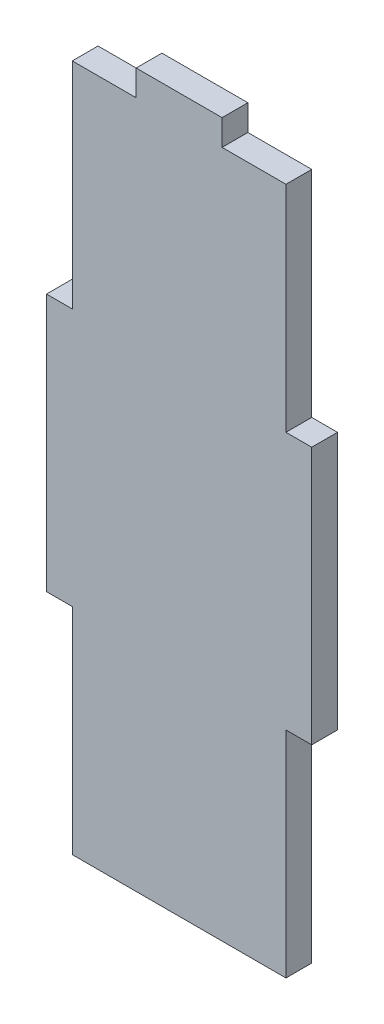
ISO-10303-21;
HEADER;
FILE_DESCRIPTION(('STEP AP214'),'2;1');
FILE_NAME('part.step','',(''),(''),'','','');
FILE_SCHEMA(('AUTOMOTIVE_DESIGN { 1 0 10303 214 1 1 1 1 }'));
ENDSEC;
DATA;
#1=APPLICATION_CONTEXT('core data for automotive mechanical design processes');
#2=APPLICATION_PROTOCOL_DEFINITION('international standard','automotive_design',2000,#1);
#3=PRODUCT_CONTEXT('',#1,'mechanical');
#4=PRODUCT('Part','Part','',(#3));
#5=PRODUCT_RELATED_PRODUCT_CATEGORY('part','',(#4));
#6=PRODUCT_DEFINITION_FORMATION('','',#4);
#7=PRODUCT_DEFINITION_CONTEXT('part definition',#1,'design');
#8=PRODUCT_DEFINITION('design','',#6,#7);
#9=PRODUCT_DEFINITION_SHAPE('','',#8);
#10=(LENGTH_UNIT() NAMED_UNIT(*) SI_UNIT(.MILLI.,.METRE.));
#11=(NAMED_UNIT(*) PLANE_ANGLE_UNIT() SI_UNIT($,.RADIAN.));
#12=(NAMED_UNIT(*) SI_UNIT($,.STERADIAN.) SOLID_ANGLE_UNIT());
#13=UNCERTAINTY_MEASURE_WITH_UNIT(LENGTH_MEASURE(1.E-05),#10,'distance_accuracy_value','');
#14=(GEOMETRIC_REPRESENTATION_CONTEXT(3) GLOBAL_UNCERTAINTY_ASSIGNED_CONTEXT((#13)) GLOBAL_UNIT_ASSIGNED_CONTEXT((#10,
#11,#12)) REPRESENTATION_CONTEXT('',''));
#15=CARTESIAN_POINT('',(0.,0.,0.));
#16=DIRECTION('',(0.,0.,1.));
#17=DIRECTION('',(1.,0.,0.));
#18=AXIS2_PLACEMENT_3D('',#15,#16,#17);
#19=CARTESIAN_POINT('',(24.87,0.,3.));
#20=DIRECTION('',(1.,0.,0.));
#21=DIRECTION('',(0.,1.,0.));
#22=AXIS2_PLACEMENT_3D('',#19,#20,#21);
#23=PLANE('',#22);
#24=DIRECTION('',(0.,-1.,0.));
#25=VECTOR('',#24,1.);
#26=CARTESIAN_POINT('',(24.87,0.,0.));
#27=LINE('',#26,#25);
#28=CARTESIAN_POINT('',(24.87,-55.,0.));
#29=VERTEX_POINT('',#28);
#30=CARTESIAN_POINT('',(24.87,-80.,0.));
#31=VERTEX_POINT('',#30);
#32=EDGE_CURVE('E195',#29,#31,#27,.T.);
#33=ORIENTED_EDGE('',*,*,#32,.F.);
#34=DIRECTION('',(0.,0.,-1.));
#35=VECTOR('',#34,1.);
#36=CARTESIAN_POINT('',(24.87,-55.,3.));
#37=LINE('',#36,#35);
#38=CARTESIAN_POINT('',(24.87,-55.,3.));
#39=VERTEX_POINT('',#38);
#40=EDGE_CURVE('E11',#39,#29,#37,.T.);
#41=ORIENTED_EDGE('',*,*,#40,.F.);
#42=DIRECTION('',(0.,-1.,0.));
#43=VECTOR('',#42,1.);
#44=CARTESIAN_POINT('',(24.87,0.,3.));
#45=LINE('',#44,#43);
#46=CARTESIAN_POINT('',(24.87,-80.,3.));
#47=VERTEX_POINT('',#46);
#48=EDGE_CURVE('E252',#39,#47,#45,.T.);
#49=ORIENTED_EDGE('',*,*,#48,.T.);
#50=DIRECTION('',(0.,0.,-1.));
#51=VECTOR('',#50,1.);
#52=CARTESIAN_POINT('',(24.87,-80.,3.));
#53=LINE('',#52,#51);
#54=EDGE_CURVE('E122',#47,#31,#53,.T.);
#55=ORIENTED_EDGE('',*,*,#54,.T.);
#56=EDGE_LOOP('',(#33,#41,#49,#55));
#57=FACE_BOUND('',#56,.T.);
#58=ADVANCED_FACE('F47',(#57),#23,.T.);
#59=CARTESIAN_POINT('',(0.,-55.,3.));
#60=DIRECTION('',(0.,1.,0.));
#61=DIRECTION('',(0.,0.,1.));
#62=AXIS2_PLACEMENT_3D('',#59,#60,#61);
#63=PLANE('',#62);
#64=DIRECTION('',(1.,0.,0.));
#65=VECTOR('',#64,1.);
#66=CARTESIAN_POINT('',(0.,-55.,0.));
#67=LINE('',#66,#65);
#68=CARTESIAN_POINT('',(27.87,-55.,0.));
#69=VERTEX_POINT('',#68);
#70=EDGE_CURVE('E199',#29,#69,#67,.T.);
#71=ORIENTED_EDGE('',*,*,#70,.T.);
#72=DIRECTION('',(0.,0.,-1.));
#73=VECTOR('',#72,1.);
#74=CARTESIAN_POINT('',(27.87,-55.,3.));
#75=LINE('',#74,#73);
#76=CARTESIAN_POINT('',(27.87,-55.,3.));
#77=VERTEX_POINT('',#76);
#78=EDGE_CURVE('E56',#77,#69,#75,.T.);
#79=ORIENTED_EDGE('',*,*,#78,.F.);
#80=DIRECTION('',(1.,0.,0.));
#81=VECTOR('',#80,1.);
#82=CARTESIAN_POINT('',(0.,-55.,3.));
#83=LINE('',#82,#81);
#84=EDGE_CURVE('E312',#39,#77,#83,.T.);
#85=ORIENTED_EDGE('',*,*,#84,.F.);
#86=ORIENTED_EDGE('',*,*,#40,.T.);
#87=EDGE_LOOP('',(#71,#79,#85,#86));
#88=FACE_BOUND('',#87,.T.);
#89=ADVANCED_FACE('F300',(#88),#63,.F.);
#90=CARTESIAN_POINT('',(27.87,0.,3.));
#91=DIRECTION('',(1.,0.,0.));
#92=DIRECTION('',(0.,1.,0.));
#93=AXIS2_PLACEMENT_3D('',#90,#91,#92);
#94=PLANE('',#93);
#95=DIRECTION('',(0.,-1.,0.));
#96=VECTOR('',#95,1.);
#97=CARTESIAN_POINT('',(27.87,0.,0.));
#98=LINE('',#97,#96);
#99=CARTESIAN_POINT('',(27.87,-25.,0.));
#100=VERTEX_POINT('',#99);
#101=EDGE_CURVE('E203',#100,#69,#98,.T.);
#102=ORIENTED_EDGE('',*,*,#101,.F.);
#103=DIRECTION('',(0.,0.,-1.));
#104=VECTOR('',#103,1.);
#105=CARTESIAN_POINT('',(27.87,-25.,3.));
#106=LINE('',#105,#104);
#107=CARTESIAN_POINT('',(27.87,-25.,3.));
#108=VERTEX_POINT('',#107);
#109=EDGE_CURVE('E288',#108,#100,#106,.T.);
#110=ORIENTED_EDGE('',*,*,#109,.F.);
#111=DIRECTION('',(0.,-1.,0.));
#112=VECTOR('',#111,1.);
#113=CARTESIAN_POINT('',(27.87,0.,3.));
#114=LINE('',#113,#112);
#115=EDGE_CURVE('E297',#108,#77,#114,.T.);
#116=ORIENTED_EDGE('',*,*,#115,.T.);
#117=ORIENTED_EDGE('',*,*,#78,.T.);
#118=EDGE_LOOP('',(#102,#110,#116,#117));
#119=FACE_BOUND('',#118,.T.);
#120=ADVANCED_FACE('F295',(#119),#94,.T.);
#121=CARTESIAN_POINT('',(0.,-25.,3.));
#122=DIRECTION('',(0.,1.,0.));
#123=DIRECTION('',(0.,0.,1.));
#124=AXIS2_PLACEMENT_3D('',#121,#122,#123);
#125=PLANE('',#124);
#126=DIRECTION('',(1.,0.,0.));
#127=VECTOR('',#126,1.);
#128=CARTESIAN_POINT('',(0.,-25.,0.));
#129=LINE('',#128,#127);
#130=CARTESIAN_POINT('',(24.87,-25.,0.));
#131=VERTEX_POINT('',#130);
#132=EDGE_CURVE('E207',#131,#100,#129,.T.);
#133=ORIENTED_EDGE('',*,*,#132,.F.);
#134=DIRECTION('',(0.,0.,-1.));
#135=VECTOR('',#134,1.);
#136=CARTESIAN_POINT('',(24.87,-25.,3.));
#137=LINE('',#136,#135);
#138=CARTESIAN_POINT('',(24.87,-25.,3.));
#139=VERTEX_POINT('',#138);
#140=EDGE_CURVE('E285',#139,#131,#137,.T.);
#141=ORIENTED_EDGE('',*,*,#140,.F.);
#142=DIRECTION('',(1.,0.,0.));
#143=VECTOR('',#142,1.);
#144=CARTESIAN_POINT('',(0.,-25.,3.));
#145=LINE('',#144,#143);
#146=EDGE_CURVE('E309',#139,#108,#145,.T.);
#147=ORIENTED_EDGE('',*,*,#146,.T.);
#148=ORIENTED_EDGE('',*,*,#109,.T.);
#149=EDGE_LOOP('',(#133,#141,#147,#148));
#150=FACE_BOUND('',#149,.T.);
#151=ADVANCED_FACE('F306',(#150),#125,.T.);
#152=CARTESIAN_POINT('',(24.87,0.,3.));
#153=DIRECTION('',(1.,0.,0.));
#154=DIRECTION('',(0.,1.,0.));
#155=AXIS2_PLACEMENT_3D('',#152,#153,#154);
#156=PLANE('',#155);
#157=DIRECTION('',(0.,-1.,0.));
#158=VECTOR('',#157,1.);
#159=CARTESIAN_POINT('',(24.87,0.,0.));
#160=LINE('',#159,#158);
#161=CARTESIAN_POINT('',(24.87,0.,0.));
#162=VERTEX_POINT('',#161);
#163=EDGE_CURVE('E211',#162,#131,#160,.T.);
#164=ORIENTED_EDGE('',*,*,#163,.F.);
#165=DIRECTION('',(0.,0.,-1.));
#166=VECTOR('',#165,1.);
#167=CARTESIAN_POINT('',(24.87,0.,3.));
#168=LINE('',#167,#166);
#169=CARTESIAN_POINT('',(24.87,0.,3.));
#170=VERTEX_POINT('',#169);
#171=EDGE_CURVE('E282',#170,#162,#168,.T.);
#172=ORIENTED_EDGE('',*,*,#171,.F.);
#173=DIRECTION('',(0.,-1.,0.));
#174=VECTOR('',#173,1.);
#175=CARTESIAN_POINT('',(24.87,0.,3.));
#176=LINE('',#175,#174);
#177=EDGE_CURVE('E317',#170,#139,#176,.T.);
#178=ORIENTED_EDGE('',*,*,#177,.T.);
#179=ORIENTED_EDGE('',*,*,#140,.T.);
#180=EDGE_LOOP('',(#164,#172,#178,#179));
#181=FACE_BOUND('',#180,.T.);
#182=ADVANCED_FACE('F372',(#181),#156,.T.);
#183=CARTESIAN_POINT('',(0.,0.,3.));
#184=DIRECTION('',(0.,1.,0.));
#185=DIRECTION('',(0.,0.,1.));
#186=AXIS2_PLACEMENT_3D('',#183,#184,#185);
#187=PLANE('',#186);
#188=DIRECTION('',(1.,0.,0.));
#189=VECTOR('',#188,1.);
#190=CARTESIAN_POINT('',(0.,0.,0.));
#191=LINE('',#190,#189);
#192=CARTESIAN_POINT('',(17.435,0.,0.));
#193=VERTEX_POINT('',#192);
#194=EDGE_CURVE('E215',#193,#162,#191,.T.);
#195=ORIENTED_EDGE('',*,*,#194,.F.);
#196=DIRECTION('',(0.,0.,-1.));
#197=VECTOR('',#196,1.);
#198=CARTESIAN_POINT('',(17.435,0.,3.));
#199=LINE('',#198,#197);
#200=CARTESIAN_POINT('',(17.435,0.,3.));
#201=VERTEX_POINT('',#200);
#202=EDGE_CURVE('E279',#201,#193,#199,.T.);
#203=ORIENTED_EDGE('',*,*,#202,.F.);
#204=DIRECTION('',(1.,0.,0.));
#205=VECTOR('',#204,1.);
#206=CARTESIAN_POINT('',(0.,0.,3.));
#207=LINE('',#206,#205);
#208=EDGE_CURVE('E324',#201,#170,#207,.T.);
#209=ORIENTED_EDGE('',*,*,#208,.T.);
#210=ORIENTED_EDGE('',*,*,#171,.T.);
#211=EDGE_LOOP('',(#195,#203,#209,#210));
#212=FACE_BOUND('',#211,.T.);
#213=ADVANCED_FACE('F375',(#212),#187,.T.);
#214=CARTESIAN_POINT('',(17.435,0.,3.));
#215=DIRECTION('',(-1.,0.,0.));
#216=DIRECTION('',(0.,0.,1.));
#217=AXIS2_PLACEMENT_3D('',#214,#215,#216);
#218=PLANE('',#217);
#219=DIRECTION('',(0.,1.,0.));
#220=VECTOR('',#219,1.);
#221=CARTESIAN_POINT('',(17.435,0.,0.));
#222=LINE('',#221,#220);
#223=CARTESIAN_POINT('',(17.435,3.,0.));
#224=VERTEX_POINT('',#223);
#225=EDGE_CURVE('E219',#193,#224,#222,.T.);
#226=ORIENTED_EDGE('',*,*,#225,.T.);
#227=DIRECTION('',(0.,0.,-1.));
#228=VECTOR('',#227,1.);
#229=CARTESIAN_POINT('',(17.435,3.,3.));
#230=LINE('',#229,#228);
#231=CARTESIAN_POINT('',(17.435,3.,3.));
#232=VERTEX_POINT('',#231);
#233=EDGE_CURVE('E276',#232,#224,#230,.T.);
#234=ORIENTED_EDGE('',*,*,#233,.F.);
#235=DIRECTION('',(0.,1.,0.));
#236=VECTOR('',#235,1.);
#237=CARTESIAN_POINT('',(17.435,0.,3.));
#238=LINE('',#237,#236);
#239=EDGE_CURVE('E328',#201,#232,#238,.T.);
#240=ORIENTED_EDGE('',*,*,#239,.F.);
#241=ORIENTED_EDGE('',*,*,#202,.T.);
#242=EDGE_LOOP('',(#226,#234,#240,#241));
#243=FACE_BOUND('',#242,.T.);
#244=ADVANCED_FACE('F379',(#243),#218,.F.);
#245=CARTESIAN_POINT('',(0.,3.,3.));
#246=DIRECTION('',(0.,1.,0.));
#247=DIRECTION('',(0.,0.,1.));
#248=AXIS2_PLACEMENT_3D('',#245,#246,#247);
#249=PLANE('',#248);
#250=DIRECTION('',(1.,0.,0.));
#251=VECTOR('',#250,1.);
#252=CARTESIAN_POINT('',(0.,3.,0.));
#253=LINE('',#252,#251);
#254=CARTESIAN_POINT('',(7.435,3.,0.));
#255=VERTEX_POINT('',#254);
#256=EDGE_CURVE('E223',#255,#224,#253,.T.);
#257=ORIENTED_EDGE('',*,*,#256,.F.);
#258=DIRECTION('',(0.,0.,-1.));
#259=VECTOR('',#258,1.);
#260=CARTESIAN_POINT('',(7.435,3.,3.));
#261=LINE('',#260,#259);
#262=CARTESIAN_POINT('',(7.435,3.,3.));
#263=VERTEX_POINT('',#262);
#264=EDGE_CURVE('E273',#263,#255,#261,.T.);
#265=ORIENTED_EDGE('',*,*,#264,.F.);
#266=DIRECTION('',(1.,0.,0.));
#267=VECTOR('',#266,1.);
#268=CARTESIAN_POINT('',(0.,3.,3.));
#269=LINE('',#268,#267);
#270=EDGE_CURVE('E331',#263,#232,#269,.T.);
#271=ORIENTED_EDGE('',*,*,#270,.T.);
#272=ORIENTED_EDGE('',*,*,#233,.T.);
#273=EDGE_LOOP('',(#257,#265,#271,#272));
#274=FACE_BOUND('',#273,.T.);
#275=ADVANCED_FACE('F383',(#274),#249,.T.);
#276=CARTESIAN_POINT('',(7.435,0.,3.));
#277=DIRECTION('',(-1.,0.,0.));
#278=DIRECTION('',(0.,0.,1.));
#279=AXIS2_PLACEMENT_3D('',#276,#277,#278);
#280=PLANE('',#279);
#281=DIRECTION('',(0.,1.,0.));
#282=VECTOR('',#281,1.);
#283=CARTESIAN_POINT('',(7.435,0.,0.));
#284=LINE('',#283,#282);
#285=CARTESIAN_POINT('',(7.435,0.,0.));
#286=VERTEX_POINT('',#285);
#287=EDGE_CURVE('E227',#286,#255,#284,.T.);
#288=ORIENTED_EDGE('',*,*,#287,.F.);
#289=DIRECTION('',(0.,0.,-1.));
#290=VECTOR('',#289,1.);
#291=CARTESIAN_POINT('',(7.435,0.,3.));
#292=LINE('',#291,#290);
#293=CARTESIAN_POINT('',(7.435,0.,3.));
#294=VERTEX_POINT('',#293);
#295=EDGE_CURVE('E270',#294,#286,#292,.T.);
#296=ORIENTED_EDGE('',*,*,#295,.F.);
#297=DIRECTION('',(0.,1.,0.));
#298=VECTOR('',#297,1.);
#299=CARTESIAN_POINT('',(7.435,0.,3.));
#300=LINE('',#299,#298);
#301=EDGE_CURVE('E335',#294,#263,#300,.T.);
#302=ORIENTED_EDGE('',*,*,#301,.T.);
#303=ORIENTED_EDGE('',*,*,#264,.T.);
#304=EDGE_LOOP('',(#288,#296,#302,#303));
#305=FACE_BOUND('',#304,.T.);
#306=ADVANCED_FACE('F387',(#305),#280,.T.);
#307=CARTESIAN_POINT('',(0.,0.,3.));
#308=DIRECTION('',(0.,1.,0.));
#309=DIRECTION('',(0.,0.,1.));
#310=AXIS2_PLACEMENT_3D('',#307,#308,#309);
#311=PLANE('',#310);
#312=DIRECTION('',(1.,0.,0.));
#313=VECTOR('',#312,1.);
#314=CARTESIAN_POINT('',(0.,0.,0.));
#315=LINE('',#314,#313);
#316=CARTESIAN_POINT('',(0.,0.,0.));
#317=VERTEX_POINT('',#316);
#318=EDGE_CURVE('E231',#317,#286,#315,.T.);
#319=ORIENTED_EDGE('',*,*,#318,.F.);
#320=DIRECTION('',(0.,0.,-1.));
#321=VECTOR('',#320,1.);
#322=CARTESIAN_POINT('',(0.,0.,3.));
#323=LINE('',#322,#321);
#324=CARTESIAN_POINT('',(0.,0.,3.));
#325=VERTEX_POINT('',#324);
#326=EDGE_CURVE('E267',#325,#317,#323,.T.);
#327=ORIENTED_EDGE('',*,*,#326,.F.);
#328=DIRECTION('',(1.,0.,0.));
#329=VECTOR('',#328,1.);
#330=CARTESIAN_POINT('',(0.,0.,3.));
#331=LINE('',#330,#329);
#332=EDGE_CURVE('E339',#325,#294,#331,.T.);
#333=ORIENTED_EDGE('',*,*,#332,.T.);
#334=ORIENTED_EDGE('',*,*,#295,.T.);
#335=EDGE_LOOP('',(#319,#327,#333,#334));
#336=FACE_BOUND('',#335,.T.);
#337=ADVANCED_FACE('F391',(#336),#311,.T.);
#338=CARTESIAN_POINT('',(0.,0.,3.));
#339=DIRECTION('',(1.,0.,0.));
#340=DIRECTION('',(0.,1.,0.));
#341=AXIS2_PLACEMENT_3D('',#338,#339,#340);
#342=PLANE('',#341);
#343=DIRECTION('',(0.,-1.,0.));
#344=VECTOR('',#343,1.);
#345=CARTESIAN_POINT('',(0.,0.,0.));
#346=LINE('',#345,#344);
#347=CARTESIAN_POINT('',(0.,-25.,0.));
#348=VERTEX_POINT('',#347);
#349=EDGE_CURVE('E235',#317,#348,#346,.T.);
#350=ORIENTED_EDGE('',*,*,#349,.T.);
#351=DIRECTION('',(0.,0.,-1.));
#352=VECTOR('',#351,1.);
#353=CARTESIAN_POINT('',(0.,-25.,3.));
#354=LINE('',#353,#352);
#355=CARTESIAN_POINT('',(0.,-25.,3.));
#356=VERTEX_POINT('',#355);
#357=EDGE_CURVE('E263',#356,#348,#354,.T.);
#358=ORIENTED_EDGE('',*,*,#357,.F.);
#359=DIRECTION('',(0.,-1.,0.));
#360=VECTOR('',#359,1.);
#361=CARTESIAN_POINT('',(0.,0.,3.));
#362=LINE('',#361,#360);
#363=EDGE_CURVE('E343',#325,#356,#362,.T.);
#364=ORIENTED_EDGE('',*,*,#363,.F.);
#365=ORIENTED_EDGE('',*,*,#326,.T.);
#366=EDGE_LOOP('',(#350,#358,#364,#365));
#367=FACE_BOUND('',#366,.T.);
#368=ADVANCED_FACE('F395',(#367),#342,.F.);
#369=CARTESIAN_POINT('',(0.,-25.,3.));
#370=DIRECTION('',(0.,-1.,0.));
#371=DIRECTION('',(0.,0.,-1.));
#372=AXIS2_PLACEMENT_3D('',#369,#370,#371);
#373=PLANE('',#372);
#374=DIRECTION('',(-1.,0.,0.));
#375=VECTOR('',#374,1.);
#376=CARTESIAN_POINT('',(0.,-25.,0.));
#377=LINE('',#376,#375);
#378=CARTESIAN_POINT('',(-3.,-25.,0.));
#379=VERTEX_POINT('',#378);
#380=EDGE_CURVE('E238',#348,#379,#377,.T.);
#381=ORIENTED_EDGE('',*,*,#380,.T.);
#382=DIRECTION('',(0.,0.,-1.));
#383=VECTOR('',#382,1.);
#384=CARTESIAN_POINT('',(-3.,-25.,3.));
#385=LINE('',#384,#383);
#386=CARTESIAN_POINT('',(-3.,-25.,3.));
#387=VERTEX_POINT('',#386);
#388=EDGE_CURVE('E259',#387,#379,#385,.T.);
#389=ORIENTED_EDGE('',*,*,#388,.F.);
#390=DIRECTION('',(-1.,0.,0.));
#391=VECTOR('',#390,1.);
#392=CARTESIAN_POINT('',(0.,-25.,3.));
#393=LINE('',#392,#391);
#394=EDGE_CURVE('E189',#356,#387,#393,.T.);
#395=ORIENTED_EDGE('',*,*,#394,.F.);
#396=ORIENTED_EDGE('',*,*,#357,.T.);
#397=EDGE_LOOP('',(#381,#389,#395,#396));
#398=FACE_BOUND('',#397,.T.);
#399=ADVANCED_FACE('F352',(#398),#373,.F.);
#400=CARTESIAN_POINT('',(-3.,0.,3.));
#401=DIRECTION('',(1.,0.,0.));
#402=DIRECTION('',(0.,1.,0.));
#403=AXIS2_PLACEMENT_3D('',#400,#401,#402);
#404=PLANE('',#403);
#405=DIRECTION('',(0.,-1.,0.));
#406=VECTOR('',#405,1.);
#407=CARTESIAN_POINT('',(-3.,0.,0.));
#408=LINE('',#407,#406);
#409=CARTESIAN_POINT('',(-2.99999999999999,-55.,0.));
#410=VERTEX_POINT('',#409);
#411=EDGE_CURVE('E241',#379,#410,#408,.T.);
#412=ORIENTED_EDGE('',*,*,#411,.T.);
#413=DIRECTION('',(0.,0.,-1.));
#414=VECTOR('',#413,1.);
#415=CARTESIAN_POINT('',(-2.99999999999999,-55.,3.));
#416=LINE('',#415,#414);
#417=CARTESIAN_POINT('',(-2.99999999999999,-55.,3.));
#418=VERTEX_POINT('',#417);
#419=EDGE_CURVE('E175',#418,#410,#416,.T.);
#420=ORIENTED_EDGE('',*,*,#419,.F.);
#421=DIRECTION('',(0.,-1.,0.));
#422=VECTOR('',#421,1.);
#423=CARTESIAN_POINT('',(-3.,0.,3.));
#424=LINE('',#423,#422);
#425=EDGE_CURVE('E184',#387,#418,#424,.T.);
#426=ORIENTED_EDGE('',*,*,#425,.F.);
#427=ORIENTED_EDGE('',*,*,#388,.T.);
#428=EDGE_LOOP('',(#412,#420,#426,#427));
#429=FACE_BOUND('',#428,.T.);
#430=ADVANCED_FACE('F356',(#429),#404,.F.);
#431=CARTESIAN_POINT('',(0.,-55.,3.));
#432=DIRECTION('',(0.,-1.,0.));
#433=DIRECTION('',(0.,0.,-1.));
#434=AXIS2_PLACEMENT_3D('',#431,#432,#433);
#435=PLANE('',#434);
#436=DIRECTION('',(-1.,0.,0.));
#437=VECTOR('',#436,1.);
#438=CARTESIAN_POINT('',(0.,-55.,0.));
#439=LINE('',#438,#437);
#440=CARTESIAN_POINT('',(0.,-55.,0.));
#441=VERTEX_POINT('',#440);
#442=EDGE_CURVE('E173',#441,#410,#439,.T.);
#443=ORIENTED_EDGE('',*,*,#442,.F.);
#444=DIRECTION('',(0.,0.,-1.));
#445=VECTOR('',#444,1.);
#446=CARTESIAN_POINT('',(0.,-55.,3.));
#447=LINE('',#446,#445);
#448=CARTESIAN_POINT('',(0.,-55.,3.));
#449=VERTEX_POINT('',#448);
#450=EDGE_CURVE('E167',#449,#441,#447,.T.);
#451=ORIENTED_EDGE('',*,*,#450,.F.);
#452=DIRECTION('',(-1.,0.,0.));
#453=VECTOR('',#452,1.);
#454=CARTESIAN_POINT('',(0.,-55.,3.));
#455=LINE('',#454,#453);
#456=EDGE_CURVE('E171',#449,#418,#455,.T.);
#457=ORIENTED_EDGE('',*,*,#456,.T.);
#458=ORIENTED_EDGE('',*,*,#419,.T.);
#459=EDGE_LOOP('',(#443,#451,#457,#458));
#460=FACE_BOUND('',#459,.T.);
#461=ADVANCED_FACE('F169',(#460),#435,.T.);
#462=CARTESIAN_POINT('',(0.,0.,3.));
#463=DIRECTION('',(1.,0.,0.));
#464=DIRECTION('',(0.,1.,0.));
#465=AXIS2_PLACEMENT_3D('',#462,#463,#464);
#466=PLANE('',#465);
#467=DIRECTION('',(0.,-1.,0.));
#468=VECTOR('',#467,1.);
#469=CARTESIAN_POINT('',(0.,0.,0.));
#470=LINE('',#469,#468);
#471=CARTESIAN_POINT('',(0.,-80.,0.));
#472=VERTEX_POINT('',#471);
#473=EDGE_CURVE('E115',#441,#472,#470,.T.);
#474=ORIENTED_EDGE('',*,*,#473,.T.);
#475=DIRECTION('',(0.,0.,-1.));
#476=VECTOR('',#475,1.);
#477=CARTESIAN_POINT('',(0.,-80.,3.));
#478=LINE('',#477,#476);
#479=CARTESIAN_POINT('',(0.,-80.,3.));
#480=VERTEX_POINT('',#479);
#481=EDGE_CURVE('E176',#480,#472,#478,.T.);
#482=ORIENTED_EDGE('',*,*,#481,.F.);
#483=DIRECTION('',(0.,-1.,0.));
#484=VECTOR('',#483,1.);
#485=CARTESIAN_POINT('',(0.,0.,3.));
#486=LINE('',#485,#484);
#487=EDGE_CURVE('E178',#449,#480,#486,.T.);
#488=ORIENTED_EDGE('',*,*,#487,.F.);
#489=ORIENTED_EDGE('',*,*,#450,.T.);
#490=EDGE_LOOP('',(#474,#482,#488,#489));
#491=FACE_BOUND('',#490,.T.);
#492=ADVANCED_FACE('F179',(#491),#466,.F.);
#493=CARTESIAN_POINT('',(0.,-80.,3.));
#494=DIRECTION('',(0.,1.,0.));
#495=DIRECTION('',(0.,0.,1.));
#496=AXIS2_PLACEMENT_3D('',#493,#494,#495);
#497=PLANE('',#496);
#498=DIRECTION('',(1.,0.,0.));
#499=VECTOR('',#498,1.);
#500=CARTESIAN_POINT('',(0.,-80.,0.));
#501=LINE('',#500,#499);
#502=EDGE_CURVE('E249',#472,#31,#501,.T.);
#503=ORIENTED_EDGE('',*,*,#502,.T.);
#504=ORIENTED_EDGE('',*,*,#54,.F.);
#505=DIRECTION('',(1.,0.,0.));
#506=VECTOR('',#505,1.);
#507=CARTESIAN_POINT('',(0.,-80.,3.));
#508=LINE('',#507,#506);
#509=EDGE_CURVE('E64',#480,#47,#508,.T.);
#510=ORIENTED_EDGE('',*,*,#509,.F.);
#511=ORIENTED_EDGE('',*,*,#481,.T.);
#512=EDGE_LOOP('',(#503,#504,#510,#511));
#513=FACE_BOUND('',#512,.T.);
#514=ADVANCED_FACE('F359',(#513),#497,.F.);
#515=CARTESIAN_POINT('',(0.,0.,3.));
#516=DIRECTION('',(0.,0.,1.));
#517=DIRECTION('',(1.,0.,0.));
#518=AXIS2_PLACEMENT_3D('',#515,#516,#517);
#519=PLANE('',#518);
#520=ORIENTED_EDGE('',*,*,#48,.F.);
#521=ORIENTED_EDGE('',*,*,#84,.T.);
#522=ORIENTED_EDGE('',*,*,#115,.F.);
#523=ORIENTED_EDGE('',*,*,#146,.F.);
#524=ORIENTED_EDGE('',*,*,#177,.F.);
#525=ORIENTED_EDGE('',*,*,#208,.F.);
#526=ORIENTED_EDGE('',*,*,#239,.T.);
#527=ORIENTED_EDGE('',*,*,#270,.F.);
#528=ORIENTED_EDGE('',*,*,#301,.F.);
#529=ORIENTED_EDGE('',*,*,#332,.F.);
#530=ORIENTED_EDGE('',*,*,#363,.T.);
#531=ORIENTED_EDGE('',*,*,#394,.T.);
#532=ORIENTED_EDGE('',*,*,#425,.T.);
#533=ORIENTED_EDGE('',*,*,#456,.F.);
#534=ORIENTED_EDGE('',*,*,#487,.T.);
#535=ORIENTED_EDGE('',*,*,#509,.T.);
#536=EDGE_LOOP('',(#520,#521,#522,#523,#524,#525,#526,#527,#528,#529,#530,#531,#532,#533,#534,#535));
#537=FACE_BOUND('',#536,.T.);
#538=ADVANCED_FACE('F182',(#537),#519,.T.);
#539=CARTESIAN_POINT('',(0.,0.,0.));
#540=DIRECTION('',(0.,0.,1.));
#541=DIRECTION('',(1.,0.,0.));
#542=AXIS2_PLACEMENT_3D('',#539,#540,#541);
#543=PLANE('',#542);
#544=ORIENTED_EDGE('',*,*,#32,.T.);
#545=ORIENTED_EDGE('',*,*,#502,.F.);
#546=ORIENTED_EDGE('',*,*,#473,.F.);
#547=ORIENTED_EDGE('',*,*,#442,.T.);
#548=ORIENTED_EDGE('',*,*,#411,.F.);
#549=ORIENTED_EDGE('',*,*,#380,.F.);
#550=ORIENTED_EDGE('',*,*,#349,.F.);
#551=ORIENTED_EDGE('',*,*,#318,.T.);
#552=ORIENTED_EDGE('',*,*,#287,.T.);
#553=ORIENTED_EDGE('',*,*,#256,.T.);
#554=ORIENTED_EDGE('',*,*,#225,.F.);
#555=ORIENTED_EDGE('',*,*,#194,.T.);
#556=ORIENTED_EDGE('',*,*,#163,.T.);
#557=ORIENTED_EDGE('',*,*,#132,.T.);
#558=ORIENTED_EDGE('',*,*,#101,.T.);
#559=ORIENTED_EDGE('',*,*,#70,.F.);
#560=EDGE_LOOP('',(#544,#545,#546,#547,#548,#549,#550,#551,#552,#553,#554,#555,#556,#557,#558,#559));
#561=FACE_BOUND('',#560,.T.);
#562=ADVANCED_FACE('F302',(#561),#543,.F.);
#563=CLOSED_SHELL('',(#58,#89,#120,#151,#182,#213,#244,#275,#306,#337,#368,#399,#430,#461,#492,
#514,#538,#562));
#564=MANIFOLD_SOLID_BREP('B2',#563);
#565=ADVANCED_BREP_SHAPE_REPRESENTATION('',(#18,#564),#14);
#566=SHAPE_DEFINITION_REPRESENTATION(#9,#565);
ENDSEC;
END-ISO-10303-21;
